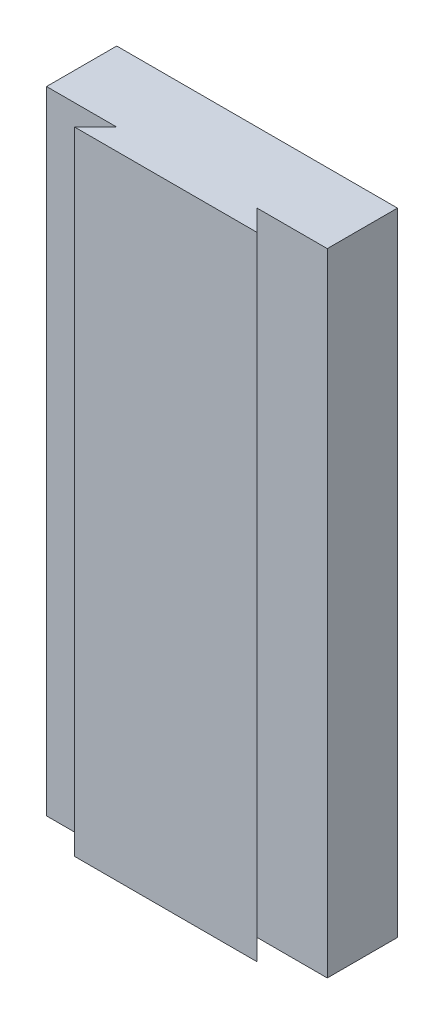
ISO-10303-21;
HEADER;
FILE_DESCRIPTION(('STEP AP214'),'2;1');
FILE_NAME('part.step','',(''),(''),'','','');
FILE_SCHEMA(('AUTOMOTIVE_DESIGN { 1 0 10303 214 1 1 1 1 }'));
ENDSEC;
DATA;
#1=APPLICATION_CONTEXT('core data for automotive mechanical design processes');
#2=APPLICATION_PROTOCOL_DEFINITION('international standard','automotive_design',2000,#1);
#3=PRODUCT_CONTEXT('',#1,'mechanical');
#4=PRODUCT('Part','Part','',(#3));
#5=PRODUCT_RELATED_PRODUCT_CATEGORY('part','',(#4));
#6=PRODUCT_DEFINITION_FORMATION('','',#4);
#7=PRODUCT_DEFINITION_CONTEXT('part definition',#1,'design');
#8=PRODUCT_DEFINITION('design','',#6,#7);
#9=PRODUCT_DEFINITION_SHAPE('','',#8);
#10=(LENGTH_UNIT() NAMED_UNIT(*) SI_UNIT(.MILLI.,.METRE.));
#11=(NAMED_UNIT(*) PLANE_ANGLE_UNIT() SI_UNIT($,.RADIAN.));
#12=(NAMED_UNIT(*) SI_UNIT($,.STERADIAN.) SOLID_ANGLE_UNIT());
#13=UNCERTAINTY_MEASURE_WITH_UNIT(LENGTH_MEASURE(1.E-05),#10,'distance_accuracy_value','');
#14=(GEOMETRIC_REPRESENTATION_CONTEXT(3) GLOBAL_UNCERTAINTY_ASSIGNED_CONTEXT((#13)) GLOBAL_UNIT_ASSIGNED_CONTEXT((#10,
#11,#12)) REPRESENTATION_CONTEXT('',''));
#15=CARTESIAN_POINT('',(0.,0.,0.));
#16=DIRECTION('',(0.,0.,1.));
#17=DIRECTION('',(1.,0.,0.));
#18=AXIS2_PLACEMENT_3D('',#15,#16,#17);
#19=CARTESIAN_POINT('',(0.,0.,10.));
#20=DIRECTION('',(0.,0.,1.));
#21=DIRECTION('',(1.,0.,0.));
#22=AXIS2_PLACEMENT_3D('',#19,#20,#21);
#23=PLANE('',#22);
#24=DIRECTION('',(-1.,0.,0.));
#25=VECTOR('',#24,1.);
#26=CARTESIAN_POINT('',(0.,0.,10.));
#27=LINE('',#26,#25);
#28=CARTESIAN_POINT('',(40.,0.,10.));
#29=VERTEX_POINT('',#28);
#30=CARTESIAN_POINT('',(30.,0.,10.));
#31=VERTEX_POINT('',#30);
#32=EDGE_CURVE('E58',#29,#31,#27,.T.);
#33=ORIENTED_EDGE('',*,*,#32,.T.);
#34=DIRECTION('',(0.,-1.,0.));
#35=VECTOR('',#34,1.);
#36=CARTESIAN_POINT('',(30.,26.1725046566048,10.));
#37=LINE('',#36,#35);
#38=CARTESIAN_POINT('',(30.,-90.,10.));
#39=VERTEX_POINT('',#38);
#40=EDGE_CURVE('E111',#31,#39,#37,.T.);
#41=ORIENTED_EDGE('',*,*,#40,.T.);
#42=DIRECTION('',(1.,0.,0.));
#43=VECTOR('',#42,1.);
#44=CARTESIAN_POINT('',(0.,-90.,10.));
#45=LINE('',#44,#43);
#46=CARTESIAN_POINT('',(40.,-90.,10.));
#47=VERTEX_POINT('',#46);
#48=EDGE_CURVE('E125',#39,#47,#45,.T.);
#49=ORIENTED_EDGE('',*,*,#48,.T.);
#50=DIRECTION('',(0.,1.,0.));
#51=VECTOR('',#50,1.);
#52=CARTESIAN_POINT('',(40.,0.,10.));
#53=LINE('',#52,#51);
#54=EDGE_CURVE('E144',#47,#29,#53,.T.);
#55=ORIENTED_EDGE('',*,*,#54,.T.);
#56=EDGE_LOOP('',(#33,#41,#49,#55));
#57=FACE_BOUND('',#56,.T.);
#58=ADVANCED_FACE('F35',(#57),#23,.T.);
#59=CARTESIAN_POINT('',(0.,0.,10.));
#60=DIRECTION('',(1.,0.,0.));
#61=DIRECTION('',(0.,1.,0.));
#62=AXIS2_PLACEMENT_3D('',#59,#60,#61);
#63=PLANE('',#62);
#64=DIRECTION('',(0.,-1.,0.));
#65=VECTOR('',#64,1.);
#66=CARTESIAN_POINT('',(0.,0.,0.));
#67=LINE('',#66,#65);
#68=CARTESIAN_POINT('',(0.,0.,0.));
#69=VERTEX_POINT('',#68);
#70=CARTESIAN_POINT('',(0.,-90.,0.));
#71=VERTEX_POINT('',#70);
#72=EDGE_CURVE('E137',#69,#71,#67,.T.);
#73=ORIENTED_EDGE('',*,*,#72,.T.);
#74=DIRECTION('',(0.,0.,-1.));
#75=VECTOR('',#74,1.);
#76=CARTESIAN_POINT('',(0.,-90.,10.));
#77=LINE('',#76,#75);
#78=CARTESIAN_POINT('',(0.,-90.,10.));
#79=VERTEX_POINT('',#78);
#80=EDGE_CURVE('E11',#79,#71,#77,.T.);
#81=ORIENTED_EDGE('',*,*,#80,.F.);
#82=DIRECTION('',(0.,-1.,0.));
#83=VECTOR('',#82,1.);
#84=CARTESIAN_POINT('',(0.,0.,10.));
#85=LINE('',#84,#83);
#86=CARTESIAN_POINT('',(0.,0.,10.));
#87=VERTEX_POINT('',#86);
#88=EDGE_CURVE('E138',#87,#79,#85,.T.);
#89=ORIENTED_EDGE('',*,*,#88,.F.);
#90=DIRECTION('',(0.,0.,-1.));
#91=VECTOR('',#90,1.);
#92=CARTESIAN_POINT('',(0.,0.,10.));
#93=LINE('',#92,#91);
#94=EDGE_CURVE('E148',#87,#69,#93,.T.);
#95=ORIENTED_EDGE('',*,*,#94,.T.);
#96=EDGE_LOOP('',(#73,#81,#89,#95));
#97=FACE_BOUND('',#96,.T.);
#98=ADVANCED_FACE('F37',(#97),#63,.F.);
#99=CARTESIAN_POINT('',(0.,-90.,10.));
#100=DIRECTION('',(0.,1.,0.));
#101=DIRECTION('',(0.,0.,1.));
#102=AXIS2_PLACEMENT_3D('',#99,#100,#101);
#103=PLANE('',#102);
#104=DIRECTION('',(1.,0.,0.));
#105=VECTOR('',#104,1.);
#106=CARTESIAN_POINT('',(0.,-90.,0.));
#107=LINE('',#106,#105);
#108=CARTESIAN_POINT('',(40.,-90.,0.));
#109=VERTEX_POINT('',#108);
#110=EDGE_CURVE('E151',#71,#109,#107,.T.);
#111=ORIENTED_EDGE('',*,*,#110,.T.);
#112=DIRECTION('',(0.,0.,-1.));
#113=VECTOR('',#112,1.);
#114=CARTESIAN_POINT('',(40.,-90.,10.));
#115=LINE('',#114,#113);
#116=EDGE_CURVE('E43',#47,#109,#115,.T.);
#117=ORIENTED_EDGE('',*,*,#116,.F.);
#118=ORIENTED_EDGE('',*,*,#48,.F.);
#119=DIRECTION('',(0.707106781186547,0.,0.707106781186547));
#120=VECTOR('',#119,1.);
#121=CARTESIAN_POINT('',(33.,-90.,13.));
#122=LINE('',#121,#120);
#123=CARTESIAN_POINT('',(33.,-90.,13.));
#124=VERTEX_POINT('',#123);
#125=EDGE_CURVE('E106',#39,#124,#122,.T.);
#126=ORIENTED_EDGE('',*,*,#125,.T.);
#127=DIRECTION('',(-1.,0.,0.));
#128=VECTOR('',#127,1.);
#129=CARTESIAN_POINT('',(7.00000000000001,-90.,13.));
#130=LINE('',#129,#128);
#131=CARTESIAN_POINT('',(7.00000000000001,-90.,13.));
#132=VERTEX_POINT('',#131);
#133=EDGE_CURVE('E114',#124,#132,#130,.T.);
#134=ORIENTED_EDGE('',*,*,#133,.T.);
#135=DIRECTION('',(0.707106781186547,0.,-0.707106781186547));
#136=VECTOR('',#135,1.);
#137=CARTESIAN_POINT('',(10.,-90.,10.));
#138=LINE('',#137,#136);
#139=CARTESIAN_POINT('',(10.,-90.,10.));
#140=VERTEX_POINT('',#139);
#141=EDGE_CURVE('E120',#132,#140,#138,.T.);
#142=ORIENTED_EDGE('',*,*,#141,.T.);
#143=EDGE_CURVE('E142',#79,#140,#45,.T.);
#144=ORIENTED_EDGE('',*,*,#143,.F.);
#145=ORIENTED_EDGE('',*,*,#80,.T.);
#146=EDGE_LOOP('',(#111,#117,#118,#126,#134,#142,#144,#145));
#147=FACE_BOUND('',#146,.T.);
#148=ADVANCED_FACE('F123',(#147),#103,.F.);
#149=CARTESIAN_POINT('',(40.,0.,10.));
#150=DIRECTION('',(-1.,0.,0.));
#151=DIRECTION('',(0.,-1.,0.));
#152=AXIS2_PLACEMENT_3D('',#149,#150,#151);
#153=PLANE('',#152);
#154=DIRECTION('',(0.,1.,0.));
#155=VECTOR('',#154,1.);
#156=CARTESIAN_POINT('',(40.,0.,0.));
#157=LINE('',#156,#155);
#158=CARTESIAN_POINT('',(40.,0.,0.));
#159=VERTEX_POINT('',#158);
#160=EDGE_CURVE('E153',#109,#159,#157,.T.);
#161=ORIENTED_EDGE('',*,*,#160,.T.);
#162=DIRECTION('',(0.,0.,-1.));
#163=VECTOR('',#162,1.);
#164=CARTESIAN_POINT('',(40.,0.,10.));
#165=LINE('',#164,#163);
#166=EDGE_CURVE('E158',#29,#159,#165,.T.);
#167=ORIENTED_EDGE('',*,*,#166,.F.);
#168=ORIENTED_EDGE('',*,*,#54,.F.);
#169=ORIENTED_EDGE('',*,*,#116,.T.);
#170=EDGE_LOOP('',(#161,#167,#168,#169));
#171=FACE_BOUND('',#170,.T.);
#172=ADVANCED_FACE('F164',(#171),#153,.F.);
#173=CARTESIAN_POINT('',(0.,0.,10.));
#174=DIRECTION('',(0.,-1.,0.));
#175=DIRECTION('',(0.,0.,-1.));
#176=AXIS2_PLACEMENT_3D('',#173,#174,#175);
#177=PLANE('',#176);
#178=DIRECTION('',(-1.,0.,0.));
#179=VECTOR('',#178,1.);
#180=CARTESIAN_POINT('',(0.,0.,0.));
#181=LINE('',#180,#179);
#182=EDGE_CURVE('E141',#159,#69,#181,.T.);
#183=ORIENTED_EDGE('',*,*,#182,.T.);
#184=ORIENTED_EDGE('',*,*,#94,.F.);
#185=CARTESIAN_POINT('',(10.,0.,10.));
#186=VERTEX_POINT('',#185);
#187=EDGE_CURVE('E146',#186,#87,#27,.T.);
#188=ORIENTED_EDGE('',*,*,#187,.F.);
#189=DIRECTION('',(-0.707106781186548,0.,0.707106781186548));
#190=VECTOR('',#189,1.);
#191=CARTESIAN_POINT('',(10.,0.,10.));
#192=LINE('',#191,#190);
#193=CARTESIAN_POINT('',(7.00000000000001,0.,13.));
#194=VERTEX_POINT('',#193);
#195=EDGE_CURVE('E128',#186,#194,#192,.T.);
#196=ORIENTED_EDGE('',*,*,#195,.T.);
#197=DIRECTION('',(1.,0.,0.));
#198=VECTOR('',#197,1.);
#199=CARTESIAN_POINT('',(7.00000000000001,0.,13.));
#200=LINE('',#199,#198);
#201=CARTESIAN_POINT('',(33.,0.,13.));
#202=VERTEX_POINT('',#201);
#203=EDGE_CURVE('E133',#194,#202,#200,.T.);
#204=ORIENTED_EDGE('',*,*,#203,.T.);
#205=DIRECTION('',(-0.707106781186548,0.,-0.707106781186548));
#206=VECTOR('',#205,1.);
#207=CARTESIAN_POINT('',(33.,0.,13.));
#208=LINE('',#207,#206);
#209=EDGE_CURVE('E107',#202,#31,#208,.T.);
#210=ORIENTED_EDGE('',*,*,#209,.T.);
#211=ORIENTED_EDGE('',*,*,#32,.F.);
#212=ORIENTED_EDGE('',*,*,#166,.T.);
#213=EDGE_LOOP('',(#183,#184,#188,#196,#204,#210,#211,#212));
#214=FACE_BOUND('',#213,.T.);
#215=ADVANCED_FACE('F172',(#214),#177,.F.);
#216=DIRECTION('',(0.,-1.,0.));
#217=VECTOR('',#216,1.);
#218=CARTESIAN_POINT('',(10.,26.1725046566048,10.));
#219=LINE('',#218,#217);
#220=EDGE_CURVE('E50',#186,#140,#219,.T.);
#221=ORIENTED_EDGE('',*,*,#220,.F.);
#222=ORIENTED_EDGE('',*,*,#187,.T.);
#223=ORIENTED_EDGE('',*,*,#88,.T.);
#224=ORIENTED_EDGE('',*,*,#143,.T.);
#225=EDGE_LOOP('',(#221,#222,#223,#224));
#226=FACE_BOUND('',#225,.T.);
#227=ADVANCED_FACE('F176',(#226),#23,.T.);
#228=CARTESIAN_POINT('',(0.,0.,0.));
#229=DIRECTION('',(0.,0.,1.));
#230=DIRECTION('',(1.,0.,0.));
#231=AXIS2_PLACEMENT_3D('',#228,#229,#230);
#232=PLANE('',#231);
#233=ORIENTED_EDGE('',*,*,#72,.F.);
#234=ORIENTED_EDGE('',*,*,#182,.F.);
#235=ORIENTED_EDGE('',*,*,#160,.F.);
#236=ORIENTED_EDGE('',*,*,#110,.F.);
#237=EDGE_LOOP('',(#233,#234,#235,#236));
#238=FACE_BOUND('',#237,.T.);
#239=ADVANCED_FACE('F169',(#238),#232,.F.);
#240=CARTESIAN_POINT('',(10.,26.1725046566048,10.));
#241=DIRECTION('',(-0.707106781186548,0.,-0.707106781186548));
#242=DIRECTION('',(-0.707106781186548,0.,0.707106781186548));
#243=AXIS2_PLACEMENT_3D('',#240,#241,#242);
#244=PLANE('',#243);
#245=ORIENTED_EDGE('',*,*,#195,.F.);
#246=ORIENTED_EDGE('',*,*,#220,.T.);
#247=ORIENTED_EDGE('',*,*,#141,.F.);
#248=DIRECTION('',(0.,-1.,0.));
#249=VECTOR('',#248,1.);
#250=CARTESIAN_POINT('',(7.00000000000001,26.1725046566048,13.));
#251=LINE('',#250,#249);
#252=EDGE_CURVE('E110',#194,#132,#251,.T.);
#253=ORIENTED_EDGE('',*,*,#252,.F.);
#254=EDGE_LOOP('',(#245,#246,#247,#253));
#255=FACE_BOUND('',#254,.T.);
#256=ADVANCED_FACE('F179',(#255),#244,.T.);
#257=CARTESIAN_POINT('',(7.00000000000001,26.1725046566048,13.));
#258=DIRECTION('',(0.,0.,1.));
#259=DIRECTION('',(1.,0.,0.));
#260=AXIS2_PLACEMENT_3D('',#257,#258,#259);
#261=PLANE('',#260);
#262=ORIENTED_EDGE('',*,*,#203,.F.);
#263=ORIENTED_EDGE('',*,*,#252,.T.);
#264=ORIENTED_EDGE('',*,*,#133,.F.);
#265=DIRECTION('',(0.,-1.,0.));
#266=VECTOR('',#265,1.);
#267=CARTESIAN_POINT('',(33.,26.1725046566048,13.));
#268=LINE('',#267,#266);
#269=EDGE_CURVE('E101',#202,#124,#268,.T.);
#270=ORIENTED_EDGE('',*,*,#269,.F.);
#271=EDGE_LOOP('',(#262,#263,#264,#270));
#272=FACE_BOUND('',#271,.T.);
#273=ADVANCED_FACE('F115',(#272),#261,.T.);
#274=CARTESIAN_POINT('',(33.,26.1725046566048,13.));
#275=DIRECTION('',(0.707106781186548,0.,-0.707106781186548));
#276=DIRECTION('',(-0.707106781186548,0.,-0.707106781186548));
#277=AXIS2_PLACEMENT_3D('',#274,#275,#276);
#278=PLANE('',#277);
#279=ORIENTED_EDGE('',*,*,#209,.F.);
#280=ORIENTED_EDGE('',*,*,#269,.T.);
#281=ORIENTED_EDGE('',*,*,#125,.F.);
#282=ORIENTED_EDGE('',*,*,#40,.F.);
#283=EDGE_LOOP('',(#279,#280,#281,#282));
#284=FACE_BOUND('',#283,.T.);
#285=ADVANCED_FACE('F103',(#284),#278,.T.);
#286=CLOSED_SHELL('',(#58,#98,#148,#172,#215,#227,#239,#256,#273,#285));
#287=MANIFOLD_SOLID_BREP('B2',#286);
#288=ADVANCED_BREP_SHAPE_REPRESENTATION('',(#18,#287),#14);
#289=SHAPE_DEFINITION_REPRESENTATION(#9,#288);
ENDSEC;
END-ISO-10303-21;
